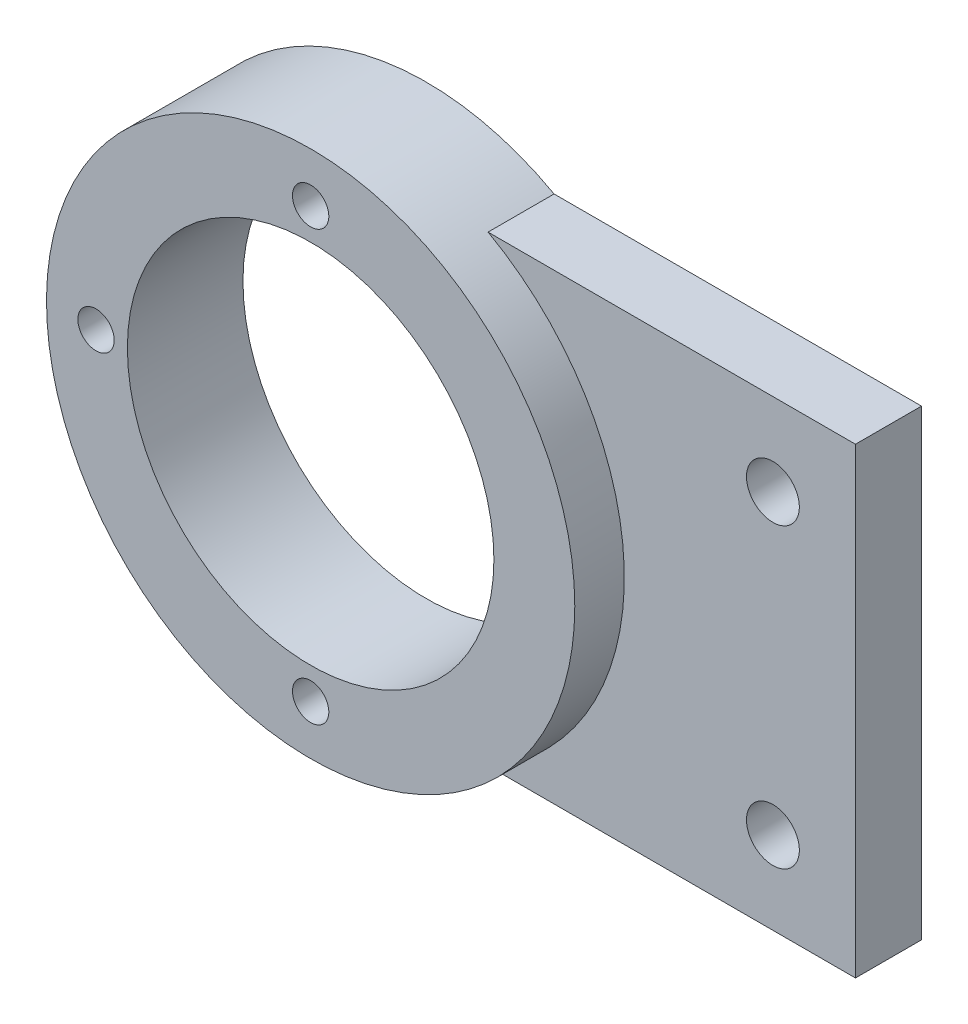
ISO-10303-21;
HEADER;
FILE_DESCRIPTION(('STEP AP214'),'2;1');
FILE_NAME('part.step','',(''),(''),'','','');
FILE_SCHEMA(('AUTOMOTIVE_DESIGN { 1 0 10303 214 1 1 1 1 }'));
ENDSEC;
DATA;
#1=APPLICATION_CONTEXT('core data for automotive mechanical design processes');
#2=APPLICATION_PROTOCOL_DEFINITION('international standard','automotive_design',2000,#1);
#3=PRODUCT_CONTEXT('',#1,'mechanical');
#4=PRODUCT('Part','Part','',(#3));
#5=PRODUCT_RELATED_PRODUCT_CATEGORY('part','',(#4));
#6=PRODUCT_DEFINITION_FORMATION('','',#4);
#7=PRODUCT_DEFINITION_CONTEXT('part definition',#1,'design');
#8=PRODUCT_DEFINITION('design','',#6,#7);
#9=PRODUCT_DEFINITION_SHAPE('','',#8);
#10=(LENGTH_UNIT() NAMED_UNIT(*) SI_UNIT(.MILLI.,.METRE.));
#11=(NAMED_UNIT(*) PLANE_ANGLE_UNIT() SI_UNIT($,.RADIAN.));
#12=(NAMED_UNIT(*) SI_UNIT($,.STERADIAN.) SOLID_ANGLE_UNIT());
#13=UNCERTAINTY_MEASURE_WITH_UNIT(LENGTH_MEASURE(1.E-05),#10,'distance_accuracy_value','');
#14=(GEOMETRIC_REPRESENTATION_CONTEXT(3) GLOBAL_UNCERTAINTY_ASSIGNED_CONTEXT((#13)) GLOBAL_UNIT_ASSIGNED_CONTEXT((#10,
#11,#12)) REPRESENTATION_CONTEXT('',''));
#15=CARTESIAN_POINT('',(0.,0.,0.));
#16=DIRECTION('',(0.,0.,1.));
#17=DIRECTION('',(1.,0.,0.));
#18=AXIS2_PLACEMENT_3D('',#15,#16,#17);
#19=CARTESIAN_POINT('',(0.,0.,7.));
#20=DIRECTION('',(0.,0.,-1.));
#21=DIRECTION('',(-1.,0.,0.));
#22=AXIS2_PLACEMENT_3D('',#19,#20,#21);
#23=CYLINDRICAL_SURFACE('',#22,16.);
#24=CARTESIAN_POINT('',(0.,0.,7.));
#25=DIRECTION('',(0.,0.,1.));
#26=DIRECTION('',(1.,0.,0.));
#27=AXIS2_PLACEMENT_3D('',#24,#25,#26);
#28=CIRCLE('',#27,16.);
#29=CARTESIAN_POINT('',(16.,0.,7.));
#30=VERTEX_POINT('',#29);
#31=EDGE_CURVE('E140',#30,#30,#28,.T.);
#32=ORIENTED_EDGE('',*,*,#31,.F.);
#33=EDGE_LOOP('',(#32));
#34=FACE_BOUND('',#33,.T.);
#35=DIRECTION('',(0.,0.,-1.));
#36=VECTOR('',#35,1.);
#37=CARTESIAN_POINT('',(7.74596669241483,-14.,7.));
#38=LINE('',#37,#36);
#39=CARTESIAN_POINT('',(7.74596669241483,-14.,4.));
#40=VERTEX_POINT('',#39);
#41=CARTESIAN_POINT('',(7.74596669241483,-14.,0.));
#42=VERTEX_POINT('',#41);
#43=EDGE_CURVE('E11',#40,#42,#38,.T.);
#44=ORIENTED_EDGE('',*,*,#43,.F.);
#45=CARTESIAN_POINT('',(0.,0.,4.));
#46=DIRECTION('',(0.,0.,-1.));
#47=DIRECTION('',(-1.,0.,0.));
#48=AXIS2_PLACEMENT_3D('',#45,#46,#47);
#49=CIRCLE('',#48,16.);
#50=CARTESIAN_POINT('',(7.74596669241483,14.,4.));
#51=VERTEX_POINT('',#50);
#52=EDGE_CURVE('E65',#51,#40,#49,.T.);
#53=ORIENTED_EDGE('',*,*,#52,.F.);
#54=DIRECTION('',(0.,0.,-1.));
#55=VECTOR('',#54,1.);
#56=CARTESIAN_POINT('',(7.74596669241483,14.,7.));
#57=LINE('',#56,#55);
#58=CARTESIAN_POINT('',(7.74596669241483,14.,0.));
#59=VERTEX_POINT('',#58);
#60=EDGE_CURVE('E53',#59,#51,#57,.F.);
#61=ORIENTED_EDGE('',*,*,#60,.F.);
#62=CARTESIAN_POINT('',(0.,0.,0.));
#63=DIRECTION('',(0.,0.,1.));
#64=DIRECTION('',(1.,0.,0.));
#65=AXIS2_PLACEMENT_3D('',#62,#63,#64);
#66=CIRCLE('',#65,16.);
#67=EDGE_CURVE('E70',#59,#42,#66,.T.);
#68=ORIENTED_EDGE('',*,*,#67,.T.);
#69=EDGE_LOOP('',(#44,#53,#61,#68));
#70=FACE_BOUND('',#69,.T.);
#71=ADVANCED_FACE('F44',(#34,#70),#23,.T.);
#72=CARTESIAN_POINT('',(0.,0.,7.));
#73=DIRECTION('',(0.,0.,-1.));
#74=DIRECTION('',(-1.,0.,0.));
#75=AXIS2_PLACEMENT_3D('',#72,#73,#74);
#76=CYLINDRICAL_SURFACE('',#75,11.1);
#77=CARTESIAN_POINT('',(0.,0.,0.));
#78=DIRECTION('',(0.,0.,1.));
#79=DIRECTION('',(1.,0.,0.));
#80=AXIS2_PLACEMENT_3D('',#77,#78,#79);
#81=CIRCLE('',#80,11.1);
#82=CARTESIAN_POINT('',(11.1,0.,0.));
#83=VERTEX_POINT('',#82);
#84=EDGE_CURVE('E129',#83,#83,#81,.T.);
#85=ORIENTED_EDGE('',*,*,#84,.F.);
#86=EDGE_LOOP('',(#85));
#87=FACE_BOUND('',#86,.T.);
#88=CARTESIAN_POINT('',(0.,0.,7.));
#89=DIRECTION('',(0.,0.,1.));
#90=DIRECTION('',(1.,0.,0.));
#91=AXIS2_PLACEMENT_3D('',#88,#89,#90);
#92=CIRCLE('',#91,11.1);
#93=CARTESIAN_POINT('',(11.1,0.,7.));
#94=VERTEX_POINT('',#93);
#95=EDGE_CURVE('E128',#94,#94,#92,.T.);
#96=ORIENTED_EDGE('',*,*,#95,.T.);
#97=EDGE_LOOP('',(#96));
#98=FACE_BOUND('',#97,.T.);
#99=ADVANCED_FACE('F189',(#87,#98),#76,.F.);
#100=CARTESIAN_POINT('',(0.,0.,7.));
#101=DIRECTION('',(0.,0.,1.));
#102=DIRECTION('',(1.,0.,0.));
#103=AXIS2_PLACEMENT_3D('',#100,#101,#102);
#104=PLANE('',#103);
#105=CARTESIAN_POINT('',(-13.,0.,7.));
#106=DIRECTION('',(0.,0.,1.));
#107=DIRECTION('',(1.,0.,0.));
#108=AXIS2_PLACEMENT_3D('',#105,#106,#107);
#109=CIRCLE('',#108,1.1);
#110=CARTESIAN_POINT('',(-14.1,0.,7.));
#111=VERTEX_POINT('',#110);
#112=EDGE_CURVE('E158',#111,#111,#109,.T.);
#113=ORIENTED_EDGE('',*,*,#112,.F.);
#114=EDGE_LOOP('',(#113));
#115=FACE_BOUND('',#114,.T.);
#116=CARTESIAN_POINT('',(0.,-13.,7.));
#117=DIRECTION('',(0.,0.,1.));
#118=DIRECTION('',(1.,0.,0.));
#119=AXIS2_PLACEMENT_3D('',#116,#117,#118);
#120=CIRCLE('',#119,1.1);
#121=CARTESIAN_POINT('',(-1.1,-13.,7.));
#122=VERTEX_POINT('',#121);
#123=EDGE_CURVE('E239',#122,#122,#120,.T.);
#124=ORIENTED_EDGE('',*,*,#123,.F.);
#125=EDGE_LOOP('',(#124));
#126=FACE_BOUND('',#125,.T.);
#127=CARTESIAN_POINT('',(0.,13.,7.));
#128=DIRECTION('',(0.,0.,1.));
#129=DIRECTION('',(1.,0.,0.));
#130=AXIS2_PLACEMENT_3D('',#127,#128,#129);
#131=CIRCLE('',#130,1.1);
#132=CARTESIAN_POINT('',(-1.1,13.,7.));
#133=VERTEX_POINT('',#132);
#134=EDGE_CURVE('E244',#133,#133,#131,.T.);
#135=ORIENTED_EDGE('',*,*,#134,.F.);
#136=EDGE_LOOP('',(#135));
#137=FACE_BOUND('',#136,.T.);
#138=ORIENTED_EDGE('',*,*,#31,.T.);
#139=EDGE_LOOP('',(#138));
#140=FACE_BOUND('',#139,.T.);
#141=ORIENTED_EDGE('',*,*,#95,.F.);
#142=EDGE_LOOP('',(#141));
#143=FACE_BOUND('',#142,.T.);
#144=ADVANCED_FACE('F175',(#115,#126,#137,#140,#143),#104,.T.);
#145=CARTESIAN_POINT('',(0.,0.,0.));
#146=DIRECTION('',(0.,0.,1.));
#147=DIRECTION('',(1.,0.,0.));
#148=AXIS2_PLACEMENT_3D('',#145,#146,#147);
#149=PLANE('',#148);
#150=CARTESIAN_POINT('',(-13.,0.,0.));
#151=DIRECTION('',(0.,0.,1.));
#152=DIRECTION('',(1.,0.,0.));
#153=AXIS2_PLACEMENT_3D('',#150,#151,#152);
#154=CIRCLE('',#153,1.1);
#155=CARTESIAN_POINT('',(-14.1,0.,0.));
#156=VERTEX_POINT('',#155);
#157=EDGE_CURVE('E48',#156,#156,#154,.F.);
#158=ORIENTED_EDGE('',*,*,#157,.F.);
#159=EDGE_LOOP('',(#158));
#160=FACE_BOUND('',#159,.T.);
#161=CARTESIAN_POINT('',(0.,-13.,0.));
#162=DIRECTION('',(0.,0.,1.));
#163=DIRECTION('',(1.,0.,0.));
#164=AXIS2_PLACEMENT_3D('',#161,#162,#163);
#165=CIRCLE('',#164,1.1);
#166=CARTESIAN_POINT('',(-1.1,-13.,0.));
#167=VERTEX_POINT('',#166);
#168=EDGE_CURVE('E160',#167,#167,#165,.F.);
#169=ORIENTED_EDGE('',*,*,#168,.F.);
#170=EDGE_LOOP('',(#169));
#171=FACE_BOUND('',#170,.T.);
#172=CARTESIAN_POINT('',(0.,13.,0.));
#173=DIRECTION('',(0.,0.,1.));
#174=DIRECTION('',(1.,0.,0.));
#175=AXIS2_PLACEMENT_3D('',#172,#173,#174);
#176=CIRCLE('',#175,1.1);
#177=CARTESIAN_POINT('',(-1.1,13.,0.));
#178=VERTEX_POINT('',#177);
#179=EDGE_CURVE('E152',#178,#178,#176,.F.);
#180=ORIENTED_EDGE('',*,*,#179,.F.);
#181=EDGE_LOOP('',(#180));
#182=FACE_BOUND('',#181,.T.);
#183=CARTESIAN_POINT('',(25.,-9.,0.));
#184=DIRECTION('',(0.,0.,1.));
#185=DIRECTION('',(1.,0.,0.));
#186=AXIS2_PLACEMENT_3D('',#183,#184,#185);
#187=CIRCLE('',#186,1.6);
#188=CARTESIAN_POINT('',(23.4,-9.,0.));
#189=VERTEX_POINT('',#188);
#190=EDGE_CURVE('E116',#189,#189,#187,.F.);
#191=ORIENTED_EDGE('',*,*,#190,.F.);
#192=EDGE_LOOP('',(#191));
#193=FACE_BOUND('',#192,.T.);
#194=CARTESIAN_POINT('',(25.,9.,0.));
#195=DIRECTION('',(0.,0.,1.));
#196=DIRECTION('',(1.,0.,0.));
#197=AXIS2_PLACEMENT_3D('',#194,#195,#196);
#198=CIRCLE('',#197,1.6);
#199=CARTESIAN_POINT('',(23.4,9.,0.));
#200=VERTEX_POINT('',#199);
#201=EDGE_CURVE('E149',#200,#200,#198,.F.);
#202=ORIENTED_EDGE('',*,*,#201,.F.);
#203=EDGE_LOOP('',(#202));
#204=FACE_BOUND('',#203,.T.);
#205=ORIENTED_EDGE('',*,*,#84,.T.);
#206=EDGE_LOOP('',(#205));
#207=FACE_BOUND('',#206,.T.);
#208=ORIENTED_EDGE('',*,*,#67,.F.);
#209=DIRECTION('',(-1.,0.,0.));
#210=VECTOR('',#209,1.);
#211=CARTESIAN_POINT('',(0.,14.,0.));
#212=LINE('',#211,#210);
#213=CARTESIAN_POINT('',(30.,14.,0.));
#214=VERTEX_POINT('',#213);
#215=EDGE_CURVE('E94',#214,#59,#212,.T.);
#216=ORIENTED_EDGE('',*,*,#215,.F.);
#217=DIRECTION('',(0.,1.,0.));
#218=VECTOR('',#217,1.);
#219=CARTESIAN_POINT('',(30.,-14.,0.));
#220=LINE('',#219,#218);
#221=CARTESIAN_POINT('',(30.,-14.,0.));
#222=VERTEX_POINT('',#221);
#223=EDGE_CURVE('E119',#222,#214,#220,.T.);
#224=ORIENTED_EDGE('',*,*,#223,.F.);
#225=DIRECTION('',(1.,0.,0.));
#226=VECTOR('',#225,1.);
#227=CARTESIAN_POINT('',(0.,-14.,0.));
#228=LINE('',#227,#226);
#229=EDGE_CURVE('E99',#42,#222,#228,.T.);
#230=ORIENTED_EDGE('',*,*,#229,.F.);
#231=EDGE_LOOP('',(#208,#216,#224,#230));
#232=FACE_BOUND('',#231,.T.);
#233=ADVANCED_FACE('F166',(#160,#171,#182,#193,#204,#207,#232),#149,.F.);
#234=CARTESIAN_POINT('',(0.,-14.,4.));
#235=DIRECTION('',(0.,1.,0.));
#236=DIRECTION('',(0.,0.,1.));
#237=AXIS2_PLACEMENT_3D('',#234,#235,#236);
#238=PLANE('',#237);
#239=DIRECTION('',(1.,0.,0.));
#240=VECTOR('',#239,1.);
#241=CARTESIAN_POINT('',(0.,-14.,4.));
#242=LINE('',#241,#240);
#243=CARTESIAN_POINT('',(30.,-14.,4.));
#244=VERTEX_POINT('',#243);
#245=EDGE_CURVE('E81',#40,#244,#242,.T.);
#246=ORIENTED_EDGE('',*,*,#245,.F.);
#247=ORIENTED_EDGE('',*,*,#43,.T.);
#248=ORIENTED_EDGE('',*,*,#229,.T.);
#249=DIRECTION('',(0.,0.,-1.));
#250=VECTOR('',#249,1.);
#251=CARTESIAN_POINT('',(30.,-14.,4.));
#252=LINE('',#251,#250);
#253=EDGE_CURVE('E100',#244,#222,#252,.T.);
#254=ORIENTED_EDGE('',*,*,#253,.F.);
#255=EDGE_LOOP('',(#246,#247,#248,#254));
#256=FACE_BOUND('',#255,.T.);
#257=ADVANCED_FACE('F98',(#256),#238,.F.);
#258=CARTESIAN_POINT('',(0.,14.,4.));
#259=DIRECTION('',(0.,-1.,0.));
#260=DIRECTION('',(0.,0.,-1.));
#261=AXIS2_PLACEMENT_3D('',#258,#259,#260);
#262=PLANE('',#261);
#263=ORIENTED_EDGE('',*,*,#215,.T.);
#264=ORIENTED_EDGE('',*,*,#60,.T.);
#265=DIRECTION('',(-1.,0.,0.));
#266=VECTOR('',#265,1.);
#267=CARTESIAN_POINT('',(0.,14.,4.));
#268=LINE('',#267,#266);
#269=CARTESIAN_POINT('',(30.,14.,4.));
#270=VERTEX_POINT('',#269);
#271=EDGE_CURVE('E109',#270,#51,#268,.T.);
#272=ORIENTED_EDGE('',*,*,#271,.F.);
#273=DIRECTION('',(0.,0.,-1.));
#274=VECTOR('',#273,1.);
#275=CARTESIAN_POINT('',(30.,14.,4.));
#276=LINE('',#275,#274);
#277=EDGE_CURVE('E102',#270,#214,#276,.T.);
#278=ORIENTED_EDGE('',*,*,#277,.T.);
#279=EDGE_LOOP('',(#263,#264,#272,#278));
#280=FACE_BOUND('',#279,.T.);
#281=ADVANCED_FACE('F187',(#280),#262,.F.);
#282=CARTESIAN_POINT('',(30.,-14.,4.));
#283=DIRECTION('',(-1.,0.,0.));
#284=DIRECTION('',(0.,0.,1.));
#285=AXIS2_PLACEMENT_3D('',#282,#283,#284);
#286=PLANE('',#285);
#287=ORIENTED_EDGE('',*,*,#223,.T.);
#288=ORIENTED_EDGE('',*,*,#277,.F.);
#289=DIRECTION('',(0.,1.,0.));
#290=VECTOR('',#289,1.);
#291=CARTESIAN_POINT('',(30.,-14.,4.));
#292=LINE('',#291,#290);
#293=EDGE_CURVE('E89',#244,#270,#292,.T.);
#294=ORIENTED_EDGE('',*,*,#293,.F.);
#295=ORIENTED_EDGE('',*,*,#253,.T.);
#296=EDGE_LOOP('',(#287,#288,#294,#295));
#297=FACE_BOUND('',#296,.T.);
#298=ADVANCED_FACE('F106',(#297),#286,.F.);
#299=CARTESIAN_POINT('',(0.,0.,4.));
#300=DIRECTION('',(0.,0.,-1.));
#301=DIRECTION('',(-1.,0.,0.));
#302=AXIS2_PLACEMENT_3D('',#299,#300,#301);
#303=PLANE('',#302);
#304=CARTESIAN_POINT('',(25.,-9.,4.));
#305=DIRECTION('',(0.,0.,-1.));
#306=DIRECTION('',(-1.,0.,0.));
#307=AXIS2_PLACEMENT_3D('',#304,#305,#306);
#308=CIRCLE('',#307,1.6);
#309=CARTESIAN_POINT('',(23.4,-9.,4.));
#310=VERTEX_POINT('',#309);
#311=EDGE_CURVE('E147',#310,#310,#308,.F.);
#312=ORIENTED_EDGE('',*,*,#311,.F.);
#313=EDGE_LOOP('',(#312));
#314=FACE_BOUND('',#313,.T.);
#315=CARTESIAN_POINT('',(25.,9.,4.));
#316=DIRECTION('',(0.,0.,-1.));
#317=DIRECTION('',(-1.,0.,0.));
#318=AXIS2_PLACEMENT_3D('',#315,#316,#317);
#319=CIRCLE('',#318,1.6);
#320=CARTESIAN_POINT('',(23.4,9.,4.));
#321=VERTEX_POINT('',#320);
#322=EDGE_CURVE('E144',#321,#321,#319,.F.);
#323=ORIENTED_EDGE('',*,*,#322,.F.);
#324=EDGE_LOOP('',(#323));
#325=FACE_BOUND('',#324,.T.);
#326=ORIENTED_EDGE('',*,*,#271,.T.);
#327=ORIENTED_EDGE('',*,*,#52,.T.);
#328=ORIENTED_EDGE('',*,*,#245,.T.);
#329=ORIENTED_EDGE('',*,*,#293,.T.);
#330=EDGE_LOOP('',(#326,#327,#328,#329));
#331=FACE_BOUND('',#330,.T.);
#332=ADVANCED_FACE('F86',(#314,#325,#331),#303,.F.);
#333=CARTESIAN_POINT('',(25.,9.,7.));
#334=DIRECTION('',(0.,0.,-1.));
#335=DIRECTION('',(-1.,0.,0.));
#336=AXIS2_PLACEMENT_3D('',#333,#334,#335);
#337=CYLINDRICAL_SURFACE('',#336,1.6);
#338=CARTESIAN_POINT('',(23.4,9.,4.));
#339=CARTESIAN_POINT('',(23.4,9.,3.95833333333333));
#340=CARTESIAN_POINT('',(23.4,9.,3.91666666666667));
#341=CARTESIAN_POINT('',(23.4,9.,3.83333333333333));
#342=CARTESIAN_POINT('',(23.4,9.,3.79166666666667));
#343=CARTESIAN_POINT('',(23.4,9.,3.70833333333333));
#344=CARTESIAN_POINT('',(23.4,9.,3.66666666666667));
#345=CARTESIAN_POINT('',(23.4,9.,3.58333333333333));
#346=CARTESIAN_POINT('',(23.4,9.,3.54166666666667));
#347=CARTESIAN_POINT('',(23.4,9.,3.45833333333333));
#348=CARTESIAN_POINT('',(23.4,9.,3.41666666666667));
#349=CARTESIAN_POINT('',(23.4,9.,3.33333333333333));
#350=CARTESIAN_POINT('',(23.4,9.,3.29166666666667));
#351=CARTESIAN_POINT('',(23.4,9.,3.20833333333333));
#352=CARTESIAN_POINT('',(23.4,9.,3.16666666666667));
#353=CARTESIAN_POINT('',(23.4,9.,3.08333333333333));
#354=CARTESIAN_POINT('',(23.4,9.,3.04166666666667));
#355=CARTESIAN_POINT('',(23.4,9.,2.95833333333333));
#356=CARTESIAN_POINT('',(23.4,9.,2.91666666666667));
#357=CARTESIAN_POINT('',(23.4,9.,2.83333333333333));
#358=CARTESIAN_POINT('',(23.4,9.,2.79166666666667));
#359=CARTESIAN_POINT('',(23.4,9.,2.70833333333333));
#360=CARTESIAN_POINT('',(23.4,9.,2.66666666666667));
#361=CARTESIAN_POINT('',(23.4,9.,2.58333333333333));
#362=CARTESIAN_POINT('',(23.4,9.,2.54166666666667));
#363=CARTESIAN_POINT('',(23.4,9.,2.45833333333333));
#364=CARTESIAN_POINT('',(23.4,9.,2.41666666666667));
#365=CARTESIAN_POINT('',(23.4,9.,2.33333333333333));
#366=CARTESIAN_POINT('',(23.4,9.,2.29166666666667));
#367=CARTESIAN_POINT('',(23.4,9.,2.20833333333333));
#368=CARTESIAN_POINT('',(23.4,9.,2.16666666666667));
#369=CARTESIAN_POINT('',(23.4,9.,2.08333333333333));
#370=CARTESIAN_POINT('',(23.4,9.,2.04166666666667));
#371=CARTESIAN_POINT('',(23.4,9.,1.95833333333333));
#372=CARTESIAN_POINT('',(23.4,9.,1.91666666666667));
#373=CARTESIAN_POINT('',(23.4,9.,1.83333333333333));
#374=CARTESIAN_POINT('',(23.4,9.,1.79166666666667));
#375=CARTESIAN_POINT('',(23.4,9.,1.70833333333333));
#376=CARTESIAN_POINT('',(23.4,9.,1.66666666666667));
#377=CARTESIAN_POINT('',(23.4,9.,1.58333333333333));
#378=CARTESIAN_POINT('',(23.4,9.,1.54166666666667));
#379=CARTESIAN_POINT('',(23.4,9.,1.45833333333333));
#380=CARTESIAN_POINT('',(23.4,9.,1.41666666666667));
#381=CARTESIAN_POINT('',(23.4,9.,1.33333333333333));
#382=CARTESIAN_POINT('',(23.4,9.,1.29166666666667));
#383=CARTESIAN_POINT('',(23.4,9.,1.20833333333333));
#384=CARTESIAN_POINT('',(23.4,9.,1.16666666666667));
#385=CARTESIAN_POINT('',(23.4,9.,1.08333333333333));
#386=CARTESIAN_POINT('',(23.4,9.,1.04166666666667));
#387=CARTESIAN_POINT('',(23.4,9.,0.958333333333333));
#388=CARTESIAN_POINT('',(23.4,9.,0.916666666666667));
#389=CARTESIAN_POINT('',(23.4,9.,0.833333333333333));
#390=CARTESIAN_POINT('',(23.4,9.,0.791666666666667));
#391=CARTESIAN_POINT('',(23.4,9.,0.708333333333333));
#392=CARTESIAN_POINT('',(23.4,9.,0.666666666666666));
#393=CARTESIAN_POINT('',(23.4,9.,0.583333333333333));
#394=CARTESIAN_POINT('',(23.4,9.,0.541666666666666));
#395=CARTESIAN_POINT('',(23.4,9.,0.458333333333333));
#396=CARTESIAN_POINT('',(23.4,9.,0.416666666666666));
#397=CARTESIAN_POINT('',(23.4,9.,0.333333333333333));
#398=CARTESIAN_POINT('',(23.4,9.,0.291666666666666));
#399=CARTESIAN_POINT('',(23.4,9.,0.208333333333333));
#400=CARTESIAN_POINT('',(23.4,9.,0.166666666666666));
#401=CARTESIAN_POINT('',(23.4,9.,0.0833333333333325));
#402=CARTESIAN_POINT('',(23.4,9.,0.0416666666666658));
#403=CARTESIAN_POINT('',(23.4,9.,0.));
#404=B_SPLINE_CURVE_WITH_KNOTS('',3,(#338,#339,#340,#341,#342,#343,#344,#345,#346,#347,#348,
#349,#350,#351,#352,#353,#354,#355,#356,#357,#358,#359,#360,#361,#362,#363,#364,#365,#366,#367,
#368,#369,#370,#371,#372,#373,#374,#375,#376,#377,#378,#379,#380,#381,#382,#383,#384,#385,#386,
#387,#388,#389,#390,#391,#392,#393,#394,#395,#396,#397,#398,#399,#400,#401,#402,#403),
.UNSPECIFIED.,.F.,.F.,(4,2,2,2,2,2,2,2,2,2,2,2,2,2,2,2,2,2,2,2,2,2,2,2,2,2,2,2,2,2,2,2,4),(0.,
0.125,0.25,0.375,0.5,0.625,0.75,0.875,1.,1.125,1.25,1.375,1.5,1.625,1.75,1.875,2.,2.125,2.25,
2.375,2.5,2.625,2.75,2.875,3.,3.125,3.25,3.375,3.5,3.625,3.75,3.875,4.),.UNSPECIFIED.);
#405=EDGE_CURVE('BSEAM220',#321,#200,#404,.T.);
#406=ORIENTED_EDGE('',*,*,#322,.T.);
#407=ORIENTED_EDGE('',*,*,#201,.T.);
#408=ORIENTED_EDGE('',*,*,#405,.T.);
#409=ORIENTED_EDGE('',*,*,#405,.F.);
#410=EDGE_LOOP('',(#406,#408,#407,#409));
#411=FACE_BOUND('',#410,.T.);
#412=ADVANCED_FACE('F220',(#411),#337,.F.);
#413=CARTESIAN_POINT('',(25.,-9.,7.));
#414=DIRECTION('',(0.,0.,-1.));
#415=DIRECTION('',(-1.,0.,0.));
#416=AXIS2_PLACEMENT_3D('',#413,#414,#415);
#417=CYLINDRICAL_SURFACE('',#416,1.6);
#418=CARTESIAN_POINT('',(23.4,-9.,4.));
#419=CARTESIAN_POINT('',(23.4,-9.,3.95833333333333));
#420=CARTESIAN_POINT('',(23.4,-9.,3.91666666666667));
#421=CARTESIAN_POINT('',(23.4,-9.,3.83333333333333));
#422=CARTESIAN_POINT('',(23.4,-9.,3.79166666666667));
#423=CARTESIAN_POINT('',(23.4,-9.,3.70833333333333));
#424=CARTESIAN_POINT('',(23.4,-9.,3.66666666666667));
#425=CARTESIAN_POINT('',(23.4,-9.,3.58333333333333));
#426=CARTESIAN_POINT('',(23.4,-9.,3.54166666666667));
#427=CARTESIAN_POINT('',(23.4,-9.,3.45833333333333));
#428=CARTESIAN_POINT('',(23.4,-9.,3.41666666666667));
#429=CARTESIAN_POINT('',(23.4,-9.,3.33333333333333));
#430=CARTESIAN_POINT('',(23.4,-9.,3.29166666666667));
#431=CARTESIAN_POINT('',(23.4,-9.,3.20833333333333));
#432=CARTESIAN_POINT('',(23.4,-9.,3.16666666666667));
#433=CARTESIAN_POINT('',(23.4,-9.,3.08333333333333));
#434=CARTESIAN_POINT('',(23.4,-9.,3.04166666666667));
#435=CARTESIAN_POINT('',(23.4,-9.,2.95833333333333));
#436=CARTESIAN_POINT('',(23.4,-9.,2.91666666666667));
#437=CARTESIAN_POINT('',(23.4,-9.,2.83333333333333));
#438=CARTESIAN_POINT('',(23.4,-9.,2.79166666666667));
#439=CARTESIAN_POINT('',(23.4,-9.,2.70833333333333));
#440=CARTESIAN_POINT('',(23.4,-9.,2.66666666666667));
#441=CARTESIAN_POINT('',(23.4,-9.,2.58333333333333));
#442=CARTESIAN_POINT('',(23.4,-9.,2.54166666666667));
#443=CARTESIAN_POINT('',(23.4,-9.,2.45833333333333));
#444=CARTESIAN_POINT('',(23.4,-9.,2.41666666666667));
#445=CARTESIAN_POINT('',(23.4,-9.,2.33333333333333));
#446=CARTESIAN_POINT('',(23.4,-9.,2.29166666666667));
#447=CARTESIAN_POINT('',(23.4,-9.,2.20833333333333));
#448=CARTESIAN_POINT('',(23.4,-9.,2.16666666666667));
#449=CARTESIAN_POINT('',(23.4,-9.,2.08333333333333));
#450=CARTESIAN_POINT('',(23.4,-9.,2.04166666666667));
#451=CARTESIAN_POINT('',(23.4,-9.,1.95833333333333));
#452=CARTESIAN_POINT('',(23.4,-9.,1.91666666666667));
#453=CARTESIAN_POINT('',(23.4,-9.,1.83333333333333));
#454=CARTESIAN_POINT('',(23.4,-9.,1.79166666666667));
#455=CARTESIAN_POINT('',(23.4,-9.,1.70833333333333));
#456=CARTESIAN_POINT('',(23.4,-9.,1.66666666666667));
#457=CARTESIAN_POINT('',(23.4,-9.,1.58333333333333));
#458=CARTESIAN_POINT('',(23.4,-9.,1.54166666666667));
#459=CARTESIAN_POINT('',(23.4,-9.,1.45833333333333));
#460=CARTESIAN_POINT('',(23.4,-9.,1.41666666666667));
#461=CARTESIAN_POINT('',(23.4,-9.,1.33333333333333));
#462=CARTESIAN_POINT('',(23.4,-9.,1.29166666666667));
#463=CARTESIAN_POINT('',(23.4,-9.,1.20833333333333));
#464=CARTESIAN_POINT('',(23.4,-9.,1.16666666666667));
#465=CARTESIAN_POINT('',(23.4,-9.,1.08333333333333));
#466=CARTESIAN_POINT('',(23.4,-9.,1.04166666666667));
#467=CARTESIAN_POINT('',(23.4,-9.,0.958333333333333));
#468=CARTESIAN_POINT('',(23.4,-9.,0.916666666666667));
#469=CARTESIAN_POINT('',(23.4,-9.,0.833333333333333));
#470=CARTESIAN_POINT('',(23.4,-9.,0.791666666666667));
#471=CARTESIAN_POINT('',(23.4,-9.,0.708333333333333));
#472=CARTESIAN_POINT('',(23.4,-9.,0.666666666666666));
#473=CARTESIAN_POINT('',(23.4,-9.,0.583333333333333));
#474=CARTESIAN_POINT('',(23.4,-9.,0.541666666666666));
#475=CARTESIAN_POINT('',(23.4,-9.,0.458333333333333));
#476=CARTESIAN_POINT('',(23.4,-9.,0.416666666666666));
#477=CARTESIAN_POINT('',(23.4,-9.,0.333333333333333));
#478=CARTESIAN_POINT('',(23.4,-9.,0.291666666666666));
#479=CARTESIAN_POINT('',(23.4,-9.,0.208333333333333));
#480=CARTESIAN_POINT('',(23.4,-9.,0.166666666666666));
#481=CARTESIAN_POINT('',(23.4,-9.,0.0833333333333325));
#482=CARTESIAN_POINT('',(23.4,-9.,0.0416666666666658));
#483=CARTESIAN_POINT('',(23.4,-9.,0.));
#484=B_SPLINE_CURVE_WITH_KNOTS('',3,(#418,#419,#420,#421,#422,#423,#424,#425,#426,#427,#428,
#429,#430,#431,#432,#433,#434,#435,#436,#437,#438,#439,#440,#441,#442,#443,#444,#445,#446,#447,
#448,#449,#450,#451,#452,#453,#454,#455,#456,#457,#458,#459,#460,#461,#462,#463,#464,#465,#466,
#467,#468,#469,#470,#471,#472,#473,#474,#475,#476,#477,#478,#479,#480,#481,#482,#483),
.UNSPECIFIED.,.F.,.F.,(4,2,2,2,2,2,2,2,2,2,2,2,2,2,2,2,2,2,2,2,2,2,2,2,2,2,2,2,2,2,2,2,4),(0.,
0.125,0.25,0.375,0.5,0.625,0.75,0.875,1.,1.125,1.25,1.375,1.5,1.625,1.75,1.875,2.,2.125,2.25,
2.375,2.5,2.625,2.75,2.875,3.,3.125,3.25,3.375,3.5,3.625,3.75,3.875,4.),.UNSPECIFIED.);
#485=EDGE_CURVE('BSEAM222',#310,#189,#484,.T.);
#486=ORIENTED_EDGE('',*,*,#311,.T.);
#487=ORIENTED_EDGE('',*,*,#190,.T.);
#488=ORIENTED_EDGE('',*,*,#485,.T.);
#489=ORIENTED_EDGE('',*,*,#485,.F.);
#490=EDGE_LOOP('',(#486,#488,#487,#489));
#491=FACE_BOUND('',#490,.T.);
#492=ADVANCED_FACE('F222',(#491),#417,.F.);
#493=CARTESIAN_POINT('',(0.,13.,7.));
#494=DIRECTION('',(0.,0.,-1.));
#495=DIRECTION('',(-1.,0.,0.));
#496=AXIS2_PLACEMENT_3D('',#493,#494,#495);
#497=CYLINDRICAL_SURFACE('',#496,1.1);
#498=CARTESIAN_POINT('',(-1.1,13.,7.));
#499=CARTESIAN_POINT('',(-1.1,13.,6.92708333333333));
#500=CARTESIAN_POINT('',(-1.1,13.,6.85416666666667));
#501=CARTESIAN_POINT('',(-1.1,13.,6.70833333333333));
#502=CARTESIAN_POINT('',(-1.1,13.,6.63541666666667));
#503=CARTESIAN_POINT('',(-1.1,13.,6.48958333333333));
#504=CARTESIAN_POINT('',(-1.1,13.,6.41666666666667));
#505=CARTESIAN_POINT('',(-1.1,13.,6.27083333333333));
#506=CARTESIAN_POINT('',(-1.1,13.,6.19791666666667));
#507=CARTESIAN_POINT('',(-1.1,13.,6.05208333333333));
#508=CARTESIAN_POINT('',(-1.1,13.,5.97916666666667));
#509=CARTESIAN_POINT('',(-1.1,13.,5.83333333333333));
#510=CARTESIAN_POINT('',(-1.1,13.,5.76041666666667));
#511=CARTESIAN_POINT('',(-1.1,13.,5.61458333333333));
#512=CARTESIAN_POINT('',(-1.1,13.,5.54166666666667));
#513=CARTESIAN_POINT('',(-1.1,13.,5.39583333333333));
#514=CARTESIAN_POINT('',(-1.1,13.,5.32291666666667));
#515=CARTESIAN_POINT('',(-1.1,13.,5.17708333333333));
#516=CARTESIAN_POINT('',(-1.1,13.,5.10416666666667));
#517=CARTESIAN_POINT('',(-1.1,13.,4.95833333333333));
#518=CARTESIAN_POINT('',(-1.1,13.,4.88541666666667));
#519=CARTESIAN_POINT('',(-1.1,13.,4.73958333333333));
#520=CARTESIAN_POINT('',(-1.1,13.,4.66666666666667));
#521=CARTESIAN_POINT('',(-1.1,13.,4.52083333333333));
#522=CARTESIAN_POINT('',(-1.1,13.,4.44791666666667));
#523=CARTESIAN_POINT('',(-1.1,13.,4.30208333333333));
#524=CARTESIAN_POINT('',(-1.1,13.,4.22916666666667));
#525=CARTESIAN_POINT('',(-1.1,13.,4.08333333333333));
#526=CARTESIAN_POINT('',(-1.1,13.,4.01041666666667));
#527=CARTESIAN_POINT('',(-1.1,13.,3.86458333333333));
#528=CARTESIAN_POINT('',(-1.1,13.,3.79166666666667));
#529=CARTESIAN_POINT('',(-1.1,13.,3.64583333333333));
#530=CARTESIAN_POINT('',(-1.1,13.,3.57291666666667));
#531=CARTESIAN_POINT('',(-1.1,13.,3.42708333333333));
#532=CARTESIAN_POINT('',(-1.1,13.,3.35416666666667));
#533=CARTESIAN_POINT('',(-1.1,13.,3.20833333333333));
#534=CARTESIAN_POINT('',(-1.1,13.,3.13541666666667));
#535=CARTESIAN_POINT('',(-1.1,13.,2.98958333333333));
#536=CARTESIAN_POINT('',(-1.1,13.,2.91666666666667));
#537=CARTESIAN_POINT('',(-1.1,13.,2.77083333333333));
#538=CARTESIAN_POINT('',(-1.1,13.,2.69791666666667));
#539=CARTESIAN_POINT('',(-1.1,13.,2.55208333333333));
#540=CARTESIAN_POINT('',(-1.1,13.,2.47916666666667));
#541=CARTESIAN_POINT('',(-1.1,13.,2.33333333333333));
#542=CARTESIAN_POINT('',(-1.1,13.,2.26041666666667));
#543=CARTESIAN_POINT('',(-1.1,13.,2.11458333333333));
#544=CARTESIAN_POINT('',(-1.1,13.,2.04166666666667));
#545=CARTESIAN_POINT('',(-1.1,13.,1.89583333333333));
#546=CARTESIAN_POINT('',(-1.1,13.,1.82291666666667));
#547=CARTESIAN_POINT('',(-1.1,13.,1.67708333333333));
#548=CARTESIAN_POINT('',(-1.1,13.,1.60416666666667));
#549=CARTESIAN_POINT('',(-1.1,13.,1.45833333333333));
#550=CARTESIAN_POINT('',(-1.1,13.,1.38541666666667));
#551=CARTESIAN_POINT('',(-1.1,13.,1.23958333333333));
#552=CARTESIAN_POINT('',(-1.1,13.,1.16666666666667));
#553=CARTESIAN_POINT('',(-1.1,13.,1.02083333333333));
#554=CARTESIAN_POINT('',(-1.1,13.,0.947916666666666));
#555=CARTESIAN_POINT('',(-1.1,13.,0.802083333333332));
#556=CARTESIAN_POINT('',(-1.1,13.,0.729166666666666));
#557=CARTESIAN_POINT('',(-1.1,13.,0.583333333333332));
#558=CARTESIAN_POINT('',(-1.1,13.,0.510416666666666));
#559=CARTESIAN_POINT('',(-1.1,13.,0.364583333333333));
#560=CARTESIAN_POINT('',(-1.1,13.,0.291666666666666));
#561=CARTESIAN_POINT('',(-1.1,13.,0.145833333333333));
#562=CARTESIAN_POINT('',(-1.1,13.,0.0729166666666657));
#563=CARTESIAN_POINT('',(-1.1,13.,0.));
#564=B_SPLINE_CURVE_WITH_KNOTS('',3,(#498,#499,#500,#501,#502,#503,#504,#505,#506,#507,#508,
#509,#510,#511,#512,#513,#514,#515,#516,#517,#518,#519,#520,#521,#522,#523,#524,#525,#526,#527,
#528,#529,#530,#531,#532,#533,#534,#535,#536,#537,#538,#539,#540,#541,#542,#543,#544,#545,#546,
#547,#548,#549,#550,#551,#552,#553,#554,#555,#556,#557,#558,#559,#560,#561,#562,#563),
.UNSPECIFIED.,.F.,.F.,(4,2,2,2,2,2,2,2,2,2,2,2,2,2,2,2,2,2,2,2,2,2,2,2,2,2,2,2,2,2,2,2,4),(0.,
0.218749999999999,0.4375,0.65625,0.875,1.09375,1.3125,1.53125,1.75,1.96875,2.1875,2.40625,2.625,
2.84375,3.0625,3.28125,3.5,3.71875,3.9375,4.15625,4.375,4.59375,4.8125,5.03125,5.25,5.46875,
5.6875,5.90625,6.125,6.34375,6.5625,6.78125,7.),.UNSPECIFIED.);
#565=EDGE_CURVE('BSEAM221',#133,#178,#564,.T.);
#566=ORIENTED_EDGE('',*,*,#134,.T.);
#567=ORIENTED_EDGE('',*,*,#179,.T.);
#568=ORIENTED_EDGE('',*,*,#565,.T.);
#569=ORIENTED_EDGE('',*,*,#565,.F.);
#570=EDGE_LOOP('',(#566,#568,#567,#569));
#571=FACE_BOUND('',#570,.T.);
#572=ADVANCED_FACE('F221',(#571),#497,.F.);
#573=CARTESIAN_POINT('',(0.,-13.,7.));
#574=DIRECTION('',(0.,0.,-1.));
#575=DIRECTION('',(-1.,0.,0.));
#576=AXIS2_PLACEMENT_3D('',#573,#574,#575);
#577=CYLINDRICAL_SURFACE('',#576,1.1);
#578=CARTESIAN_POINT('',(-1.1,-13.,7.));
#579=CARTESIAN_POINT('',(-1.1,-13.,6.92708333333333));
#580=CARTESIAN_POINT('',(-1.1,-13.,6.85416666666667));
#581=CARTESIAN_POINT('',(-1.1,-13.,6.70833333333333));
#582=CARTESIAN_POINT('',(-1.1,-13.,6.63541666666667));
#583=CARTESIAN_POINT('',(-1.1,-13.,6.48958333333333));
#584=CARTESIAN_POINT('',(-1.1,-13.,6.41666666666667));
#585=CARTESIAN_POINT('',(-1.1,-13.,6.27083333333333));
#586=CARTESIAN_POINT('',(-1.1,-13.,6.19791666666667));
#587=CARTESIAN_POINT('',(-1.1,-13.,6.05208333333333));
#588=CARTESIAN_POINT('',(-1.1,-13.,5.97916666666667));
#589=CARTESIAN_POINT('',(-1.1,-13.,5.83333333333333));
#590=CARTESIAN_POINT('',(-1.1,-13.,5.76041666666667));
#591=CARTESIAN_POINT('',(-1.1,-13.,5.61458333333333));
#592=CARTESIAN_POINT('',(-1.1,-13.,5.54166666666667));
#593=CARTESIAN_POINT('',(-1.1,-13.,5.39583333333333));
#594=CARTESIAN_POINT('',(-1.1,-13.,5.32291666666667));
#595=CARTESIAN_POINT('',(-1.1,-13.,5.17708333333333));
#596=CARTESIAN_POINT('',(-1.1,-13.,5.10416666666667));
#597=CARTESIAN_POINT('',(-1.1,-13.,4.95833333333333));
#598=CARTESIAN_POINT('',(-1.1,-13.,4.88541666666667));
#599=CARTESIAN_POINT('',(-1.1,-13.,4.73958333333333));
#600=CARTESIAN_POINT('',(-1.1,-13.,4.66666666666667));
#601=CARTESIAN_POINT('',(-1.1,-13.,4.52083333333333));
#602=CARTESIAN_POINT('',(-1.1,-13.,4.44791666666667));
#603=CARTESIAN_POINT('',(-1.1,-13.,4.30208333333333));
#604=CARTESIAN_POINT('',(-1.1,-13.,4.22916666666667));
#605=CARTESIAN_POINT('',(-1.1,-13.,4.08333333333333));
#606=CARTESIAN_POINT('',(-1.1,-13.,4.01041666666667));
#607=CARTESIAN_POINT('',(-1.1,-13.,3.86458333333333));
#608=CARTESIAN_POINT('',(-1.1,-13.,3.79166666666667));
#609=CARTESIAN_POINT('',(-1.1,-13.,3.64583333333333));
#610=CARTESIAN_POINT('',(-1.1,-13.,3.57291666666667));
#611=CARTESIAN_POINT('',(-1.1,-13.,3.42708333333333));
#612=CARTESIAN_POINT('',(-1.1,-13.,3.35416666666667));
#613=CARTESIAN_POINT('',(-1.1,-13.,3.20833333333333));
#614=CARTESIAN_POINT('',(-1.1,-13.,3.13541666666667));
#615=CARTESIAN_POINT('',(-1.1,-13.,2.98958333333333));
#616=CARTESIAN_POINT('',(-1.1,-13.,2.91666666666667));
#617=CARTESIAN_POINT('',(-1.1,-13.,2.77083333333333));
#618=CARTESIAN_POINT('',(-1.1,-13.,2.69791666666667));
#619=CARTESIAN_POINT('',(-1.1,-13.,2.55208333333333));
#620=CARTESIAN_POINT('',(-1.1,-13.,2.47916666666667));
#621=CARTESIAN_POINT('',(-1.1,-13.,2.33333333333333));
#622=CARTESIAN_POINT('',(-1.1,-13.,2.26041666666667));
#623=CARTESIAN_POINT('',(-1.1,-13.,2.11458333333333));
#624=CARTESIAN_POINT('',(-1.1,-13.,2.04166666666667));
#625=CARTESIAN_POINT('',(-1.1,-13.,1.89583333333333));
#626=CARTESIAN_POINT('',(-1.1,-13.,1.82291666666667));
#627=CARTESIAN_POINT('',(-1.1,-13.,1.67708333333333));
#628=CARTESIAN_POINT('',(-1.1,-13.,1.60416666666667));
#629=CARTESIAN_POINT('',(-1.1,-13.,1.45833333333333));
#630=CARTESIAN_POINT('',(-1.1,-13.,1.38541666666667));
#631=CARTESIAN_POINT('',(-1.1,-13.,1.23958333333333));
#632=CARTESIAN_POINT('',(-1.1,-13.,1.16666666666667));
#633=CARTESIAN_POINT('',(-1.1,-13.,1.02083333333333));
#634=CARTESIAN_POINT('',(-1.1,-13.,0.947916666666666));
#635=CARTESIAN_POINT('',(-1.1,-13.,0.802083333333332));
#636=CARTESIAN_POINT('',(-1.1,-13.,0.729166666666666));
#637=CARTESIAN_POINT('',(-1.1,-13.,0.583333333333332));
#638=CARTESIAN_POINT('',(-1.1,-13.,0.510416666666666));
#639=CARTESIAN_POINT('',(-1.1,-13.,0.364583333333333));
#640=CARTESIAN_POINT('',(-1.1,-13.,0.291666666666666));
#641=CARTESIAN_POINT('',(-1.1,-13.,0.145833333333333));
#642=CARTESIAN_POINT('',(-1.1,-13.,0.0729166666666657));
#643=CARTESIAN_POINT('',(-1.1,-13.,0.));
#644=B_SPLINE_CURVE_WITH_KNOTS('',3,(#578,#579,#580,#581,#582,#583,#584,#585,#586,#587,#588,
#589,#590,#591,#592,#593,#594,#595,#596,#597,#598,#599,#600,#601,#602,#603,#604,#605,#606,#607,
#608,#609,#610,#611,#612,#613,#614,#615,#616,#617,#618,#619,#620,#621,#622,#623,#624,#625,#626,
#627,#628,#629,#630,#631,#632,#633,#634,#635,#636,#637,#638,#639,#640,#641,#642,#643),
.UNSPECIFIED.,.F.,.F.,(4,2,2,2,2,2,2,2,2,2,2,2,2,2,2,2,2,2,2,2,2,2,2,2,2,2,2,2,2,2,2,2,4),(0.,
0.218749999999999,0.4375,0.65625,0.875,1.09375,1.3125,1.53125,1.75,1.96875,2.1875,2.40625,2.625,
2.84375,3.0625,3.28125,3.5,3.71875,3.9375,4.15625,4.375,4.59375,4.8125,5.03125,5.25,5.46875,
5.6875,5.90625,6.125,6.34375,6.5625,6.78125,7.),.UNSPECIFIED.);
#645=EDGE_CURVE('BSEAM229',#122,#167,#644,.T.);
#646=ORIENTED_EDGE('',*,*,#123,.T.);
#647=ORIENTED_EDGE('',*,*,#168,.T.);
#648=ORIENTED_EDGE('',*,*,#645,.T.);
#649=ORIENTED_EDGE('',*,*,#645,.F.);
#650=EDGE_LOOP('',(#646,#648,#647,#649));
#651=FACE_BOUND('',#650,.T.);
#652=ADVANCED_FACE('F229',(#651),#577,.F.);
#653=CARTESIAN_POINT('',(-13.,0.,7.));
#654=DIRECTION('',(0.,0.,-1.));
#655=DIRECTION('',(-1.,0.,0.));
#656=AXIS2_PLACEMENT_3D('',#653,#654,#655);
#657=CYLINDRICAL_SURFACE('',#656,1.1);
#658=CARTESIAN_POINT('',(-14.1,0.,7.));
#659=CARTESIAN_POINT('',(-14.1,0.,6.92708333333333));
#660=CARTESIAN_POINT('',(-14.1,0.,6.85416666666667));
#661=CARTESIAN_POINT('',(-14.1,0.,6.70833333333333));
#662=CARTESIAN_POINT('',(-14.1,0.,6.63541666666667));
#663=CARTESIAN_POINT('',(-14.1,0.,6.48958333333333));
#664=CARTESIAN_POINT('',(-14.1,0.,6.41666666666667));
#665=CARTESIAN_POINT('',(-14.1,0.,6.27083333333333));
#666=CARTESIAN_POINT('',(-14.1,0.,6.19791666666667));
#667=CARTESIAN_POINT('',(-14.1,0.,6.05208333333333));
#668=CARTESIAN_POINT('',(-14.1,0.,5.97916666666667));
#669=CARTESIAN_POINT('',(-14.1,0.,5.83333333333333));
#670=CARTESIAN_POINT('',(-14.1,0.,5.76041666666667));
#671=CARTESIAN_POINT('',(-14.1,0.,5.61458333333333));
#672=CARTESIAN_POINT('',(-14.1,0.,5.54166666666667));
#673=CARTESIAN_POINT('',(-14.1,0.,5.39583333333333));
#674=CARTESIAN_POINT('',(-14.1,0.,5.32291666666667));
#675=CARTESIAN_POINT('',(-14.1,0.,5.17708333333333));
#676=CARTESIAN_POINT('',(-14.1,0.,5.10416666666667));
#677=CARTESIAN_POINT('',(-14.1,0.,4.95833333333333));
#678=CARTESIAN_POINT('',(-14.1,0.,4.88541666666667));
#679=CARTESIAN_POINT('',(-14.1,0.,4.73958333333333));
#680=CARTESIAN_POINT('',(-14.1,0.,4.66666666666667));
#681=CARTESIAN_POINT('',(-14.1,0.,4.52083333333333));
#682=CARTESIAN_POINT('',(-14.1,0.,4.44791666666667));
#683=CARTESIAN_POINT('',(-14.1,0.,4.30208333333333));
#684=CARTESIAN_POINT('',(-14.1,0.,4.22916666666667));
#685=CARTESIAN_POINT('',(-14.1,0.,4.08333333333333));
#686=CARTESIAN_POINT('',(-14.1,0.,4.01041666666667));
#687=CARTESIAN_POINT('',(-14.1,0.,3.86458333333333));
#688=CARTESIAN_POINT('',(-14.1,0.,3.79166666666667));
#689=CARTESIAN_POINT('',(-14.1,0.,3.64583333333333));
#690=CARTESIAN_POINT('',(-14.1,0.,3.57291666666667));
#691=CARTESIAN_POINT('',(-14.1,0.,3.42708333333333));
#692=CARTESIAN_POINT('',(-14.1,0.,3.35416666666667));
#693=CARTESIAN_POINT('',(-14.1,0.,3.20833333333333));
#694=CARTESIAN_POINT('',(-14.1,0.,3.13541666666667));
#695=CARTESIAN_POINT('',(-14.1,0.,2.98958333333333));
#696=CARTESIAN_POINT('',(-14.1,0.,2.91666666666667));
#697=CARTESIAN_POINT('',(-14.1,0.,2.77083333333333));
#698=CARTESIAN_POINT('',(-14.1,0.,2.69791666666667));
#699=CARTESIAN_POINT('',(-14.1,0.,2.55208333333333));
#700=CARTESIAN_POINT('',(-14.1,0.,2.47916666666667));
#701=CARTESIAN_POINT('',(-14.1,0.,2.33333333333333));
#702=CARTESIAN_POINT('',(-14.1,0.,2.26041666666667));
#703=CARTESIAN_POINT('',(-14.1,0.,2.11458333333333));
#704=CARTESIAN_POINT('',(-14.1,0.,2.04166666666667));
#705=CARTESIAN_POINT('',(-14.1,0.,1.89583333333333));
#706=CARTESIAN_POINT('',(-14.1,0.,1.82291666666667));
#707=CARTESIAN_POINT('',(-14.1,0.,1.67708333333333));
#708=CARTESIAN_POINT('',(-14.1,0.,1.60416666666667));
#709=CARTESIAN_POINT('',(-14.1,0.,1.45833333333333));
#710=CARTESIAN_POINT('',(-14.1,0.,1.38541666666667));
#711=CARTESIAN_POINT('',(-14.1,0.,1.23958333333333));
#712=CARTESIAN_POINT('',(-14.1,0.,1.16666666666667));
#713=CARTESIAN_POINT('',(-14.1,0.,1.02083333333333));
#714=CARTESIAN_POINT('',(-14.1,0.,0.947916666666666));
#715=CARTESIAN_POINT('',(-14.1,0.,0.802083333333332));
#716=CARTESIAN_POINT('',(-14.1,0.,0.729166666666666));
#717=CARTESIAN_POINT('',(-14.1,0.,0.583333333333332));
#718=CARTESIAN_POINT('',(-14.1,0.,0.510416666666666));
#719=CARTESIAN_POINT('',(-14.1,0.,0.364583333333333));
#720=CARTESIAN_POINT('',(-14.1,0.,0.291666666666666));
#721=CARTESIAN_POINT('',(-14.1,0.,0.145833333333333));
#722=CARTESIAN_POINT('',(-14.1,0.,0.0729166666666657));
#723=CARTESIAN_POINT('',(-14.1,0.,0.));
#724=B_SPLINE_CURVE_WITH_KNOTS('',3,(#658,#659,#660,#661,#662,#663,#664,#665,#666,#667,#668,
#669,#670,#671,#672,#673,#674,#675,#676,#677,#678,#679,#680,#681,#682,#683,#684,#685,#686,#687,
#688,#689,#690,#691,#692,#693,#694,#695,#696,#697,#698,#699,#700,#701,#702,#703,#704,#705,#706,
#707,#708,#709,#710,#711,#712,#713,#714,#715,#716,#717,#718,#719,#720,#721,#722,#723),
.UNSPECIFIED.,.F.,.F.,(4,2,2,2,2,2,2,2,2,2,2,2,2,2,2,2,2,2,2,2,2,2,2,2,2,2,2,2,2,2,2,2,4),(0.,
0.218749999999999,0.4375,0.65625,0.875,1.09375,1.3125,1.53125,1.75,1.96875,2.1875,2.40625,2.625,
2.84375,3.0625,3.28125,3.5,3.71875,3.9375,4.15625,4.375,4.59375,4.8125,5.03125,5.25,5.46875,
5.6875,5.90625,6.125,6.34375,6.5625,6.78125,7.),.UNSPECIFIED.);
#725=EDGE_CURVE('BSEAM170',#111,#156,#724,.T.);
#726=ORIENTED_EDGE('',*,*,#112,.T.);
#727=ORIENTED_EDGE('',*,*,#157,.T.);
#728=ORIENTED_EDGE('',*,*,#725,.T.);
#729=ORIENTED_EDGE('',*,*,#725,.F.);
#730=EDGE_LOOP('',(#726,#728,#727,#729));
#731=FACE_BOUND('',#730,.T.);
#732=ADVANCED_FACE('F170',(#731),#657,.F.);
#733=CLOSED_SHELL('',(#71,#99,#144,#233,#257,#281,#298,#332,#412,#492,#572,#652,#732));
#734=MANIFOLD_SOLID_BREP('B2',#733);
#735=ADVANCED_BREP_SHAPE_REPRESENTATION('',(#18,#734),#14);
#736=SHAPE_DEFINITION_REPRESENTATION(#9,#735);
ENDSEC;
END-ISO-10303-21;
